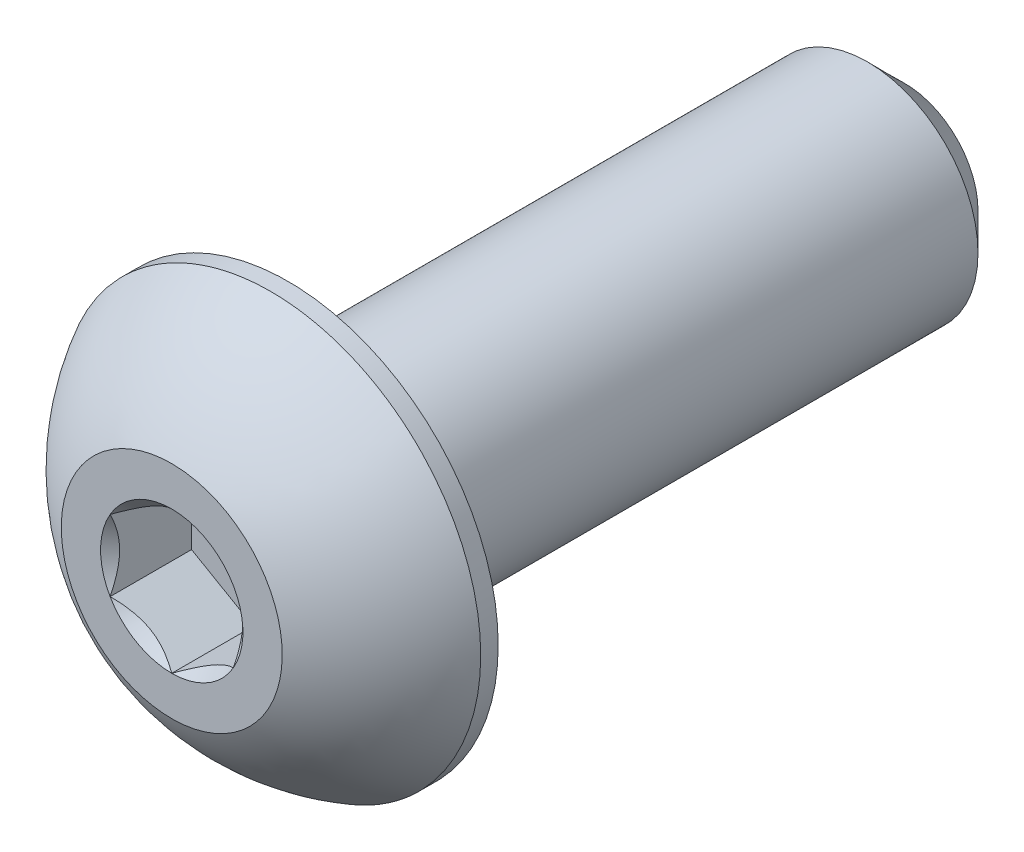
ISO-10303-21;
HEADER;
FILE_DESCRIPTION(('STEP AP214'),'2;1');
FILE_NAME('part.step','',(''),(''),'','','');
FILE_SCHEMA(('AUTOMOTIVE_DESIGN { 1 0 10303 214 1 1 1 1 }'));
ENDSEC;
DATA;
#1=APPLICATION_CONTEXT('core data for automotive mechanical design processes');
#2=APPLICATION_PROTOCOL_DEFINITION('international standard','automotive_design',2000,#1);
#3=PRODUCT_CONTEXT('',#1,'mechanical');
#4=PRODUCT('Part','Part','',(#3));
#5=PRODUCT_RELATED_PRODUCT_CATEGORY('part','',(#4));
#6=PRODUCT_DEFINITION_FORMATION('','',#4);
#7=PRODUCT_DEFINITION_CONTEXT('part definition',#1,'design');
#8=PRODUCT_DEFINITION('design','',#6,#7);
#9=PRODUCT_DEFINITION_SHAPE('','',#8);
#10=(LENGTH_UNIT() NAMED_UNIT(*) SI_UNIT(.MILLI.,.METRE.));
#11=(NAMED_UNIT(*) PLANE_ANGLE_UNIT() SI_UNIT($,.RADIAN.));
#12=(NAMED_UNIT(*) SI_UNIT($,.STERADIAN.) SOLID_ANGLE_UNIT());
#13=UNCERTAINTY_MEASURE_WITH_UNIT(LENGTH_MEASURE(1.E-05),#10,'distance_accuracy_value','');
#14=(GEOMETRIC_REPRESENTATION_CONTEXT(3) GLOBAL_UNCERTAINTY_ASSIGNED_CONTEXT((#13)) GLOBAL_UNIT_ASSIGNED_CONTEXT((#10,
#11,#12)) REPRESENTATION_CONTEXT('',''));
#15=CARTESIAN_POINT('',(0.,0.,0.));
#16=DIRECTION('',(0.,0.,1.));
#17=DIRECTION('',(1.,0.,0.));
#18=AXIS2_PLACEMENT_3D('',#15,#16,#17);
#19=CARTESIAN_POINT('',(0.79375,-0.458271776169265,-1.04902));
#20=DIRECTION('',(0.,0.,1.));
#21=DIRECTION('',(1.,0.,0.));
#22=AXIS2_PLACEMENT_3D('',#19,#20,#21);
#23=PLANE('',#22);
#24=DIRECTION('',(0.,-1.,0.));
#25=VECTOR('',#24,1.);
#26=CARTESIAN_POINT('',(-0.79375,0.458271776169265,-1.04902));
#27=LINE('',#26,#25);
#28=CARTESIAN_POINT('',(-0.79375,0.458271776169265,-1.04902));
#29=VERTEX_POINT('',#28);
#30=CARTESIAN_POINT('',(-0.79375,-0.458271776169265,-1.04902));
#31=VERTEX_POINT('',#30);
#32=EDGE_CURVE('E66',#29,#31,#27,.T.);
#33=ORIENTED_EDGE('',*,*,#32,.T.);
#34=DIRECTION('',(0.866025403784439,-0.5,0.));
#35=VECTOR('',#34,1.);
#36=CARTESIAN_POINT('',(-0.79375,-0.458271776169265,-1.04902));
#37=LINE('',#36,#35);
#38=CARTESIAN_POINT('',(0.,-0.916543552338531,-1.04902));
#39=VERTEX_POINT('',#38);
#40=EDGE_CURVE('E80',#31,#39,#37,.T.);
#41=ORIENTED_EDGE('',*,*,#40,.T.);
#42=DIRECTION('',(0.866025403784438,0.5,0.));
#43=VECTOR('',#42,1.);
#44=CARTESIAN_POINT('',(0.,-0.916543552338531,-1.04902));
#45=LINE('',#44,#43);
#46=CARTESIAN_POINT('',(0.79375,-0.458271776169266,-1.04902));
#47=VERTEX_POINT('',#46);
#48=EDGE_CURVE('E83',#39,#47,#45,.T.);
#49=ORIENTED_EDGE('',*,*,#48,.T.);
#50=DIRECTION('',(0.,1.,0.));
#51=VECTOR('',#50,1.);
#52=CARTESIAN_POINT('',(0.79375,-0.458271776169265,-1.04902));
#53=LINE('',#52,#51);
#54=CARTESIAN_POINT('',(0.79375,0.458271776169266,-1.04902));
#55=VERTEX_POINT('',#54);
#56=EDGE_CURVE('E93',#47,#55,#53,.T.);
#57=ORIENTED_EDGE('',*,*,#56,.T.);
#58=DIRECTION('',(-0.866025403784439,0.5,0.));
#59=VECTOR('',#58,1.);
#60=CARTESIAN_POINT('',(0.79375,0.458271776169265,-1.04902));
#61=LINE('',#60,#59);
#62=CARTESIAN_POINT('',(0.,0.916543552338531,-1.04902));
#63=VERTEX_POINT('',#62);
#64=EDGE_CURVE('E154',#55,#63,#61,.T.);
#65=ORIENTED_EDGE('',*,*,#64,.T.);
#66=DIRECTION('',(-0.866025403784439,-0.5,0.));
#67=VECTOR('',#66,1.);
#68=CARTESIAN_POINT('',(0.,0.916543552338531,-1.04902));
#69=LINE('',#68,#67);
#70=EDGE_CURVE('E71',#63,#29,#69,.T.);
#71=ORIENTED_EDGE('',*,*,#70,.T.);
#72=EDGE_LOOP('',(#33,#41,#49,#57,#65,#71));
#73=FACE_BOUND('',#72,.T.);
#74=ADVANCED_FACE('F17',(#73),#23,.T.);
#75=CARTESIAN_POINT('',(-0.79375,-0.458271776169265,-1.04902));
#76=DIRECTION('',(-0.5,-0.866025403784439,0.));
#77=DIRECTION('',(0.866025403784439,-0.5,0.));
#78=AXIS2_PLACEMENT_3D('',#75,#76,#77);
#79=PLANE('',#78);
#80=CARTESIAN_POINT('',(-0.793750000044271,-0.458271776130436,-1.04125312176689E-10));
#81=CARTESIAN_POINT('',(-0.766468387450507,-0.474022822513867,-0.0157358559855346));
#82=CARTESIAN_POINT('',(-0.738730682472508,-0.490037193953111,-0.0305474421759015));
#83=CARTESIAN_POINT('',(-0.682170655110562,-0.522692140978474,-0.0576668291019256));
#84=CARTESIAN_POINT('',(-0.653342956801861,-0.539335820356173,-0.0699595455816493));
#85=CARTESIAN_POINT('',(-0.595213203716242,-0.572897048947402,-0.0910168993629999));
#86=CARTESIAN_POINT('',(-0.5659259466282,-0.589806054711257,-0.0998344520441804));
#87=CARTESIAN_POINT('',(-0.506707298360598,-0.62399595722978,-0.113420138665816));
#88=CARTESIAN_POINT('',(-0.476777713816787,-0.641275810922814,-0.118198408154988));
#89=CARTESIAN_POINT('',(-0.425189875392761,-0.671060063323802,-0.122508260378903));
#90=CARTESIAN_POINT('',(-0.403598614309553,-0.683525783722347,-0.123145100154246));
#91=CARTESIAN_POINT('',(-0.360457981213041,-0.708433039853636,-0.122071781230141));
#92=CARTESIAN_POINT('',(-0.338908619505792,-0.720874569636178,-0.120361104085362));
#93=CARTESIAN_POINT('',(-0.274568421610871,-0.758021400210521,-0.111820865145472));
#94=CARTESIAN_POINT('',(-0.232097867856869,-0.782541785853028,-0.101582134265545));
#95=CARTESIAN_POINT('',(-0.157588950632502,-0.825559529269546,-0.0768844661670983));
#96=CARTESIAN_POINT('',(-0.125199877328505,-0.84425936946041,-0.0637246411289968));
#97=CARTESIAN_POINT('',(-0.0616892984270224,-0.88092721928557,-0.034082605181529));
#98=CARTESIAN_POINT('',(-0.0305640530961798,-0.898897388055925,-0.0176112094626359));
#99=CARTESIAN_POINT('',(5.13890344620887E-11,-0.9165435523682,-1.09633071497901E-10));
#100=B_SPLINE_CURVE_WITH_KNOTS('',3,(#80,#81,#82,#83,#84,#85,#86,#87,#88,#89,#90,#91,#92,#93,
#94,#95,#96,#97,#98,#99),.UNSPECIFIED.,.F.,.F.,(4,2,2,2,2,2,2,2,2,4),(0.,0.105713963861361,
0.212043598564815,0.316685078197273,0.421063200739261,0.495773440531131,0.570500182614758,
0.719996020516862,0.838779765648098,0.957181701332613),.UNSPECIFIED.);
#101=CARTESIAN_POINT('',(-0.793750000035706,-0.45827177618988,-9.80729717584741E-11));
#102=VERTEX_POINT('',#101);
#103=CARTESIAN_POINT('',(-4.53114056498212E-11,-0.916543552394829,-8.30040836589947E-11));
#104=VERTEX_POINT('',#103);
#105=EDGE_CURVE('E20',#102,#104,#100,.T.);
#106=ORIENTED_EDGE('',*,*,#105,.T.);
#107=DIRECTION('',(0.,0.,1.));
#108=VECTOR('',#107,1.);
#109=CARTESIAN_POINT('',(0.,-0.916543552338531,-1.04902));
#110=LINE('',#109,#108);
#111=EDGE_CURVE('E87',#104,#39,#110,.F.);
#112=ORIENTED_EDGE('',*,*,#111,.T.);
#113=ORIENTED_EDGE('',*,*,#40,.F.);
#114=DIRECTION('',(0.,0.,1.));
#115=VECTOR('',#114,1.);
#116=CARTESIAN_POINT('',(-0.79375,-0.458271776169265,-1.04902));
#117=LINE('',#116,#115);
#118=EDGE_CURVE('E58',#31,#102,#117,.T.);
#119=ORIENTED_EDGE('',*,*,#118,.T.);
#120=EDGE_LOOP('',(#106,#112,#113,#119));
#121=FACE_BOUND('',#120,.T.);
#122=ADVANCED_FACE('F88',(#121),#79,.F.);
#123=CARTESIAN_POINT('',(0.,-0.916543552338531,-1.04902));
#124=DIRECTION('',(0.5,-0.866025403784438,0.));
#125=DIRECTION('',(0.866025403784438,0.5,0.));
#126=AXIS2_PLACEMENT_3D('',#123,#124,#125);
#127=PLANE('',#126);
#128=CARTESIAN_POINT('',(-5.57626616020397E-11,-0.916543552357456,-1.04125185523009E-10));
#129=CARTESIAN_POINT('',(0.0272816125453579,-0.900792505986767,-0.0157358559855344));
#130=CARTESIAN_POINT('',(0.0550193175263822,-0.884778134552763,-0.0305474421759013));
#131=CARTESIAN_POINT('',(0.111579344890555,-0.852123187531257,-0.0576668291019255));
#132=CARTESIAN_POINT('',(0.140407043198436,-0.835479508152137,-0.0699595455816492));
#133=CARTESIAN_POINT('',(0.198536796283466,-0.801918279559889,-0.0910168993629998));
#134=CARTESIAN_POINT('',(0.227824053371723,-0.785009273796406,-0.0998344520441803));
#135=CARTESIAN_POINT('',(0.287042701639479,-0.750819371278149,-0.113420138665816));
#136=CARTESIAN_POINT('',(0.31697228618323,-0.733539517585012,-0.118198408154988));
#137=CARTESIAN_POINT('',(0.368560124607226,-0.703755265183972,-0.122508260378903));
#138=CARTESIAN_POINT('',(0.390151385690444,-0.691289544785444,-0.123145100154246));
#139=CARTESIAN_POINT('',(0.433292018786962,-0.666382288654166,-0.122071781230141));
#140=CARTESIAN_POINT('',(0.454841380494209,-0.65394075887162,-0.120361104085362));
#141=CARTESIAN_POINT('',(0.519181578389127,-0.616793928297271,-0.111820865145472));
#142=CARTESIAN_POINT('',(0.56165213214313,-0.592273542654767,-0.101582134265545));
#143=CARTESIAN_POINT('',(0.636161049367499,-0.549255799238251,-0.0768844661670984));
#144=CARTESIAN_POINT('',(0.668550122671495,-0.530555959047386,-0.0637246411289968));
#145=CARTESIAN_POINT('',(0.732060701572977,-0.493888109222226,-0.0340826051815291));
#146=CARTESIAN_POINT('',(0.763185946903819,-0.475917940451871,-0.0176112094626361));
#147=CARTESIAN_POINT('',(0.793750000051388,-0.458271776139596,-1.09633618367451E-10));
#148=B_SPLINE_CURVE_WITH_KNOTS('',3,(#128,#129,#130,#131,#132,#133,#134,#135,#136,#137,#138,
#139,#140,#141,#142,#143,#144,#145,#146,#147),.UNSPECIFIED.,.F.,.F.,(4,2,2,2,2,2,2,2,2,4),(0.,
0.105713963861361,0.212043598564815,0.316685078197273,0.421063200739261,0.495773440531131,
0.570500182614758,0.719996020516862,0.838779765648097,0.957181701332612),.UNSPECIFIED.);
#149=CARTESIAN_POINT('',(0.7937500000261,-0.458271776236655,-8.30043156681813E-11));
#150=VERTEX_POINT('',#149);
#151=EDGE_CURVE('E198',#104,#150,#148,.T.);
#152=ORIENTED_EDGE('',*,*,#151,.T.);
#153=DIRECTION('',(0.,0.,-1.));
#154=VECTOR('',#153,1.);
#155=CARTESIAN_POINT('',(0.79375,-0.458271776169266,-1.04902));
#156=LINE('',#155,#154);
#157=EDGE_CURVE('E97',#150,#47,#156,.T.);
#158=ORIENTED_EDGE('',*,*,#157,.T.);
#159=ORIENTED_EDGE('',*,*,#48,.F.);
#160=ORIENTED_EDGE('',*,*,#111,.F.);
#161=EDGE_LOOP('',(#152,#158,#159,#160));
#162=FACE_BOUND('',#161,.T.);
#163=ADVANCED_FACE('F95',(#162),#127,.F.);
#164=CARTESIAN_POINT('',(0.79375,-0.458271776169265,-1.04902));
#165=DIRECTION('',(1.,0.,0.));
#166=DIRECTION('',(0.,0.,-1.));
#167=AXIS2_PLACEMENT_3D('',#164,#165,#166);
#168=PLANE('',#167);
#169=ORIENTED_EDGE('',*,*,#157,.F.);
#170=CARTESIAN_POINT('',(0.793749999988507,-0.45827177622702,-1.04124807207434E-10));
#171=CARTESIAN_POINT('',(0.793749999995949,-0.426975491120204,-0.0156334823290867));
#172=CARTESIAN_POINT('',(0.793749999998932,-0.395159312437869,-0.0303541871307825));
#173=CARTESIAN_POINT('',(0.793750000001075,-0.330270832168188,-0.0573375404735409));
#174=CARTESIAN_POINT('',(0.79375000000021,-0.297191783766413,-0.0695838207478088));
#175=CARTESIAN_POINT('',(0.79374999999979,-0.230077553297126,-0.0907303862536866));
#176=CARTESIAN_POINT('',(0.79375000000023,-0.196046036759007,-0.0996419954010723));
#177=CARTESIAN_POINT('',(0.793749999999771,-0.12723734314259,-0.113362287148023));
#178=CARTESIAN_POINT('',(0.793749999998876,-0.0924628174825495,-0.11818365742675));
#179=CARTESIAN_POINT('',(0.793750000000308,-0.0479673001981395,-0.121403400473781));
#180=CARTESIAN_POINT('',(0.793750000000769,-0.0383784693535908,-0.121923817410378));
#181=CARTESIAN_POINT('',(0.793749999999232,-0.0191940940711562,-0.122619661903583));
#182=CARTESIAN_POINT('',(0.793749999997236,-0.00959855611755325,-0.122795276868053));
#183=CARTESIAN_POINT('',(0.793749999988855,0.048150555244362,-0.122784902171998));
#184=CARTESIAN_POINT('',(0.793749999997034,0.0963770615085844,-0.118313570183656));
#185=CARTESIAN_POINT('',(0.793750000002982,0.19155332040365,-0.101373453476739));
#186=CARTESIAN_POINT('',(0.793750000000694,0.23849465334187,-0.0888610878914763));
#187=CARTESIAN_POINT('',(0.793749999999547,0.314361329222952,-0.0632781708149289));
#188=CARTESIAN_POINT('',(0.793749999999774,0.343890227762418,-0.0519052657489363));
#189=CARTESIAN_POINT('',(0.793750000000223,0.401829965193103,-0.0272563335571695));
#190=CARTESIAN_POINT('',(0.793750000000445,0.43024856008334,-0.013998664808802));
#191=CARTESIAN_POINT('',(0.79375,0.458271776228839,-1.09515576499543E-10));
#192=B_SPLINE_CURVE_WITH_KNOTS('',3,(#170,#171,#172,#173,#174,#175,#176,#177,#178,#179,#180,
#181,#182,#183,#184,#185,#186,#187,#188,#189,#190,#191),.UNSPECIFIED.,.F.,.F.,(4,2,2,2,2,2,2,2,
2,2,4),(0.,0.105023602081725,0.210720694332322,0.316055529756216,0.421062415438341,
0.449866476755791,0.478654878059728,0.623070089098305,0.768274680598115,0.863134860661354,
0.957127400661586),.UNSPECIFIED.);
#193=CARTESIAN_POINT('',(0.793750000071411,0.458271776158173,-8.30040728464291E-11));
#194=VERTEX_POINT('',#193);
#195=EDGE_CURVE('E176',#150,#194,#192,.T.);
#196=ORIENTED_EDGE('',*,*,#195,.T.);
#197=DIRECTION('',(0.,0.,1.));
#198=VECTOR('',#197,1.);
#199=CARTESIAN_POINT('',(0.79375,0.458271776169266,-1.04902));
#200=LINE('',#199,#198);
#201=EDGE_CURVE('E151',#194,#55,#200,.F.);
#202=ORIENTED_EDGE('',*,*,#201,.T.);
#203=ORIENTED_EDGE('',*,*,#56,.F.);
#204=EDGE_LOOP('',(#169,#196,#202,#203));
#205=FACE_BOUND('',#204,.T.);
#206=ADVANCED_FACE('F175',(#205),#168,.F.);
#207=CARTESIAN_POINT('',(0.79375,0.458271776169265,-1.04902));
#208=DIRECTION('',(0.5,0.866025403784439,0.));
#209=DIRECTION('',(-0.866025403784439,0.5,0.));
#210=AXIS2_PLACEMENT_3D('',#207,#208,#209);
#211=PLANE('',#210);
#212=CARTESIAN_POINT('',(0.793750000044271,0.458271776130436,-1.04125160887464E-10));
#213=CARTESIAN_POINT('',(0.766468387450507,0.474022822513867,-0.0157358559855344));
#214=CARTESIAN_POINT('',(0.738730682472508,0.490037193953111,-0.0305474421759014));
#215=CARTESIAN_POINT('',(0.682170655110562,0.522692140978474,-0.0576668291019255));
#216=CARTESIAN_POINT('',(0.653342956801861,0.539335820356173,-0.0699595455816493));
#217=CARTESIAN_POINT('',(0.595213203716242,0.572897048947402,-0.0910168993629999));
#218=CARTESIAN_POINT('',(0.5659259466282,0.589806054711257,-0.0998344520441804));
#219=CARTESIAN_POINT('',(0.506707298360598,0.62399595722978,-0.113420138665816));
#220=CARTESIAN_POINT('',(0.476777713816787,0.641275810922814,-0.118198408154987));
#221=CARTESIAN_POINT('',(0.425189875392761,0.671060063323802,-0.122508260378903));
#222=CARTESIAN_POINT('',(0.403598614309553,0.683525783722347,-0.123145100154246));
#223=CARTESIAN_POINT('',(0.360457981213041,0.708433039853636,-0.122071781230141));
#224=CARTESIAN_POINT('',(0.338908619505792,0.720874569636178,-0.120361104085362));
#225=CARTESIAN_POINT('',(0.274568421610871,0.758021400210521,-0.111820865145471));
#226=CARTESIAN_POINT('',(0.232097867856869,0.782541785853028,-0.101582134265545));
#227=CARTESIAN_POINT('',(0.157588950632502,0.825559529269546,-0.0768844661670982));
#228=CARTESIAN_POINT('',(0.125199877328505,0.84425936946041,-0.0637246411289966));
#229=CARTESIAN_POINT('',(0.0616892984270225,0.88092721928557,-0.0340826051815287));
#230=CARTESIAN_POINT('',(0.0305640530961799,0.898897388055925,-0.0176112094626356));
#231=CARTESIAN_POINT('',(-5.13889953211007E-11,0.9165435523682,-1.09633010018288E-10));
#232=B_SPLINE_CURVE_WITH_KNOTS('',3,(#212,#213,#214,#215,#216,#217,#218,#219,#220,#221,#222,
#223,#224,#225,#226,#227,#228,#229,#230,#231),.UNSPECIFIED.,.F.,.F.,(4,2,2,2,2,2,2,2,2,4),(0.,
0.105713963861361,0.212043598564815,0.316685078197273,0.421063200739261,0.495773440531131,
0.570500182614758,0.719996020516862,0.838779765648098,0.957181701332613),.UNSPECIFIED.);
#233=CARTESIAN_POINT('',(4.53111479032544E-11,0.916543552394829,-8.30040559086843E-11));
#234=VERTEX_POINT('',#233);
#235=EDGE_CURVE('E181',#194,#234,#232,.T.);
#236=ORIENTED_EDGE('',*,*,#235,.T.);
#237=DIRECTION('',(0.,0.,1.));
#238=VECTOR('',#237,1.);
#239=CARTESIAN_POINT('',(0.,0.916543552338531,-1.04902));
#240=LINE('',#239,#238);
#241=EDGE_CURVE('E146',#234,#63,#240,.F.);
#242=ORIENTED_EDGE('',*,*,#241,.T.);
#243=ORIENTED_EDGE('',*,*,#64,.F.);
#244=ORIENTED_EDGE('',*,*,#201,.F.);
#245=EDGE_LOOP('',(#236,#242,#243,#244));
#246=FACE_BOUND('',#245,.T.);
#247=ADVANCED_FACE('F179',(#246),#211,.F.);
#248=CARTESIAN_POINT('',(0.,0.916543552338531,-1.04902));
#249=DIRECTION('',(-0.5,0.866025403784439,0.));
#250=DIRECTION('',(-0.866025403784439,-0.5,0.));
#251=AXIS2_PLACEMENT_3D('',#248,#249,#250);
#252=PLANE('',#251);
#253=CARTESIAN_POINT('',(5.57626530607984E-11,0.916543552357456,-1.04125131494519E-10));
#254=CARTESIAN_POINT('',(-0.027281612545358,0.900792505986767,-0.0157358559855344));
#255=CARTESIAN_POINT('',(-0.0550193175263823,0.884778134552763,-0.0305474421759013));
#256=CARTESIAN_POINT('',(-0.111579344890555,0.852123187531257,-0.0576668291019255));
#257=CARTESIAN_POINT('',(-0.140407043198436,0.835479508152137,-0.0699595455816492));
#258=CARTESIAN_POINT('',(-0.198536796283466,0.801918279559889,-0.0910168993629998));
#259=CARTESIAN_POINT('',(-0.227824053371723,0.785009273796406,-0.0998344520441803));
#260=CARTESIAN_POINT('',(-0.287042701639479,0.750819371278149,-0.113420138665816));
#261=CARTESIAN_POINT('',(-0.316972286183231,0.733539517585012,-0.118198408154987));
#262=CARTESIAN_POINT('',(-0.368560124607226,0.703755265183972,-0.122508260378902));
#263=CARTESIAN_POINT('',(-0.390151385690444,0.691289544785444,-0.123145100154246));
#264=CARTESIAN_POINT('',(-0.433292018786962,0.666382288654166,-0.122071781230141));
#265=CARTESIAN_POINT('',(-0.454841380494209,0.65394075887162,-0.120361104085362));
#266=CARTESIAN_POINT('',(-0.519181578389127,0.616793928297271,-0.111820865145471));
#267=CARTESIAN_POINT('',(-0.56165213214313,0.592273542654767,-0.101582134265545));
#268=CARTESIAN_POINT('',(-0.636161049367499,0.549255799238251,-0.0768844661670981));
#269=CARTESIAN_POINT('',(-0.668550122671495,0.530555959047386,-0.0637246411289966));
#270=CARTESIAN_POINT('',(-0.732060701572977,0.493888109222226,-0.034082605181529));
#271=CARTESIAN_POINT('',(-0.763185946903819,0.475917940451871,-0.017611209462636));
#272=CARTESIAN_POINT('',(-0.793750000051388,0.458271776139596,-1.09633305019665E-10));
#273=B_SPLINE_CURVE_WITH_KNOTS('',3,(#253,#254,#255,#256,#257,#258,#259,#260,#261,#262,#263,
#264,#265,#266,#267,#268,#269,#270,#271,#272),.UNSPECIFIED.,.F.,.F.,(4,2,2,2,2,2,2,2,2,4),(0.,
0.105713963861361,0.212043598564815,0.316685078197273,0.421063200739261,0.495773440531131,
0.570500182614758,0.719996020516862,0.838779765648098,0.957181701332612),.UNSPECIFIED.);
#274=CARTESIAN_POINT('',(-0.7937500000261,0.458271776236656,-8.30041665023388E-11));
#275=VERTEX_POINT('',#274);
#276=EDGE_CURVE('E39',#234,#275,#273,.T.);
#277=ORIENTED_EDGE('',*,*,#276,.T.);
#278=DIRECTION('',(0.,0.,1.));
#279=VECTOR('',#278,1.);
#280=CARTESIAN_POINT('',(-0.79375,0.458271776169265,-1.04902));
#281=LINE('',#280,#279);
#282=EDGE_CURVE('E139',#275,#29,#281,.F.);
#283=ORIENTED_EDGE('',*,*,#282,.T.);
#284=ORIENTED_EDGE('',*,*,#70,.F.);
#285=ORIENTED_EDGE('',*,*,#241,.F.);
#286=EDGE_LOOP('',(#277,#283,#284,#285));
#287=FACE_BOUND('',#286,.T.);
#288=ADVANCED_FACE('F183',(#287),#252,.F.);
#289=CARTESIAN_POINT('',(-0.79375,0.458271776169265,-1.04902));
#290=DIRECTION('',(-1.,0.,0.));
#291=DIRECTION('',(0.,-1.,0.));
#292=AXIS2_PLACEMENT_3D('',#289,#290,#291);
#293=PLANE('',#292);
#294=CARTESIAN_POINT('',(-0.793749999988508,0.45827177622702,-1.04125076061874E-10));
#295=CARTESIAN_POINT('',(-0.793749999995865,0.426769683460379,-0.0157358559845614));
#296=CARTESIAN_POINT('',(-0.79374999999889,0.394740940574534,-0.0305474421734395));
#297=CARTESIAN_POINT('',(-0.793750000001117,0.329431046502482,-0.0576668290950985));
#298=CARTESIAN_POINT('',(-0.793750000000297,0.29614368773308,-0.0699595455719423));
#299=CARTESIAN_POINT('',(-0.793749999999708,0.229021230525101,-0.091016899345833));
#300=CARTESIAN_POINT('',(-0.793749999999923,0.195203218985849,-0.0998344520224844));
#301=CARTESIAN_POINT('',(-0.793750000000077,0.126823413925851,-0.113420138633486));
#302=CARTESIAN_POINT('',(-0.793750000000017,0.0922637065283722,-0.118198408116553));
#303=CARTESIAN_POINT('',(-0.793749999999987,0.0326952017001382,-0.122508260329613));
#304=CARTESIAN_POINT('',(-0.793749999999996,0.00776376088789638,-0.123145100099761));
#305=CARTESIAN_POINT('',(-0.793750000000003,-0.0420507514044413,-0.122071781163585));
#306=CARTESIAN_POINT('',(-0.793750000000001,-0.0669338109841309,-0.12036110401193));
#307=CARTESIAN_POINT('',(-0.793749999999997,-0.14122747217563,-0.111820865049612));
#308=CARTESIAN_POINT('',(-0.793749999999999,-0.190268243487815,-0.101582134152341));
#309=CARTESIAN_POINT('',(-0.79375,-0.276303730289792,-0.0768844660440666));
#310=CARTESIAN_POINT('',(-0.79375,-0.31370341061652,-0.0637246410228027));
#311=CARTESIAN_POINT('',(-0.79375,-0.387039110161463,-0.034082605120921));
#312=CARTESIAN_POINT('',(-0.793749999999999,-0.422979447651795,-0.0176112094307704));
#313=CARTESIAN_POINT('',(-0.79375,-0.458271776228604,-1.09633234653498E-10));
#314=B_SPLINE_CURVE_WITH_KNOTS('',3,(#294,#295,#296,#297,#298,#299,#300,#301,#302,#303,#304,
#305,#306,#307,#308,#309,#310,#311,#312,#313),.UNSPECIFIED.,.F.,.F.,(4,2,2,2,2,2,2,2,2,4),(0.,
0.105713963893701,0.212043598629504,0.316685078293012,0.421063200866023,0.495773440702881,
0.570500182831549,0.719996020823837,0.838779765783769,0.957181701296401),.UNSPECIFIED.);
#315=EDGE_CURVE('E188',#275,#102,#314,.T.);
#316=ORIENTED_EDGE('',*,*,#315,.T.);
#317=ORIENTED_EDGE('',*,*,#118,.F.);
#318=ORIENTED_EDGE('',*,*,#32,.F.);
#319=ORIENTED_EDGE('',*,*,#282,.F.);
#320=EDGE_LOOP('',(#316,#317,#318,#319));
#321=FACE_BOUND('',#320,.T.);
#322=ADVANCED_FACE('F186',(#321),#293,.F.);
#323=CARTESIAN_POINT('',(0.,0.,-5.6843418860808E-11));
#324=DIRECTION('',(0.,0.,1.));
#325=DIRECTION('',(1.,0.,0.));
#326=AXIS2_PLACEMENT_3D('',#323,#324,#325);
#327=CONICAL_SURFACE('',#326,0.91654355242099,0.785398163397448);
#328=ORIENTED_EDGE('',*,*,#105,.F.);
#329=CARTESIAN_POINT('',(0.,0.,-5.6843418860808E-11));
#330=DIRECTION('',(0.,0.,1.));
#331=DIRECTION('',(1.,0.,0.));
#332=AXIS2_PLACEMENT_3D('',#329,#330,#331);
#333=CIRCLE('',#332,0.91654355242099);
#334=EDGE_CURVE('E192',#102,#104,#333,.T.);
#335=ORIENTED_EDGE('',*,*,#334,.T.);
#336=EDGE_LOOP('',(#328,#335));
#337=FACE_BOUND('',#336,.T.);
#338=ADVANCED_FACE('F195',(#337),#327,.F.);
#339=CARTESIAN_POINT('',(0.,0.,-5.6843418860808E-11));
#340=DIRECTION('',(0.,0.,1.));
#341=DIRECTION('',(1.,0.,0.));
#342=AXIS2_PLACEMENT_3D('',#339,#340,#341);
#343=CONICAL_SURFACE('',#342,0.91654355242099,0.785398163397448);
#344=ORIENTED_EDGE('',*,*,#151,.F.);
#345=CARTESIAN_POINT('',(0.,0.,-5.6843418860808E-11));
#346=DIRECTION('',(0.,0.,1.));
#347=DIRECTION('',(1.,0.,0.));
#348=AXIS2_PLACEMENT_3D('',#345,#346,#347);
#349=CIRCLE('',#348,0.91654355242099);
#350=EDGE_CURVE('E206',#104,#150,#349,.T.);
#351=ORIENTED_EDGE('',*,*,#350,.T.);
#352=EDGE_LOOP('',(#344,#351));
#353=FACE_BOUND('',#352,.T.);
#354=ADVANCED_FACE('F259',(#353),#343,.F.);
#355=CARTESIAN_POINT('',(0.,0.,-5.6843418860808E-11));
#356=DIRECTION('',(0.,0.,1.));
#357=DIRECTION('',(1.,0.,0.));
#358=AXIS2_PLACEMENT_3D('',#355,#356,#357);
#359=CONICAL_SURFACE('',#358,0.91654355242099,0.785398163397448);
#360=ORIENTED_EDGE('',*,*,#195,.F.);
#361=CARTESIAN_POINT('',(0.,0.,-5.6843418860808E-11));
#362=DIRECTION('',(0.,0.,1.));
#363=DIRECTION('',(1.,0.,0.));
#364=AXIS2_PLACEMENT_3D('',#361,#362,#363);
#365=CIRCLE('',#364,0.91654355242099);
#366=EDGE_CURVE('E208',#150,#194,#365,.T.);
#367=ORIENTED_EDGE('',*,*,#366,.T.);
#368=EDGE_LOOP('',(#360,#367));
#369=FACE_BOUND('',#368,.T.);
#370=ADVANCED_FACE('F234',(#369),#359,.F.);
#371=CARTESIAN_POINT('',(0.,0.,-5.6843418860808E-11));
#372=DIRECTION('',(0.,0.,1.));
#373=DIRECTION('',(1.,0.,0.));
#374=AXIS2_PLACEMENT_3D('',#371,#372,#373);
#375=CONICAL_SURFACE('',#374,0.91654355242099,0.785398163397448);
#376=ORIENTED_EDGE('',*,*,#235,.F.);
#377=CARTESIAN_POINT('',(0.,0.,-5.6843418860808E-11));
#378=DIRECTION('',(0.,0.,1.));
#379=DIRECTION('',(1.,0.,0.));
#380=AXIS2_PLACEMENT_3D('',#377,#378,#379);
#381=CIRCLE('',#380,0.91654355242099);
#382=EDGE_CURVE('E428',#194,#234,#381,.T.);
#383=ORIENTED_EDGE('',*,*,#382,.T.);
#384=EDGE_LOOP('',(#376,#383));
#385=FACE_BOUND('',#384,.T.);
#386=ADVANCED_FACE('F229',(#385),#375,.F.);
#387=CARTESIAN_POINT('',(0.,0.,-5.6843418860808E-11));
#388=DIRECTION('',(0.,0.,1.));
#389=DIRECTION('',(1.,0.,0.));
#390=AXIS2_PLACEMENT_3D('',#387,#388,#389);
#391=CONICAL_SURFACE('',#390,0.91654355242099,0.785398163397448);
#392=ORIENTED_EDGE('',*,*,#276,.F.);
#393=CARTESIAN_POINT('',(0.,0.,-5.6843418860808E-11));
#394=DIRECTION('',(0.,0.,1.));
#395=DIRECTION('',(1.,0.,0.));
#396=AXIS2_PLACEMENT_3D('',#393,#394,#395);
#397=CIRCLE('',#396,0.91654355242099);
#398=EDGE_CURVE('E202',#234,#275,#397,.T.);
#399=ORIENTED_EDGE('',*,*,#398,.T.);
#400=EDGE_LOOP('',(#392,#399));
#401=FACE_BOUND('',#400,.T.);
#402=ADVANCED_FACE('F225',(#401),#391,.F.);
#403=CARTESIAN_POINT('',(0.,0.,-5.6843418860808E-11));
#404=DIRECTION('',(0.,0.,1.));
#405=DIRECTION('',(1.,0.,0.));
#406=AXIS2_PLACEMENT_3D('',#403,#404,#405);
#407=CONICAL_SURFACE('',#406,0.91654355242099,0.785398163627513);
#408=ORIENTED_EDGE('',*,*,#315,.F.);
#409=CARTESIAN_POINT('',(0.,0.,-5.6843418860808E-11));
#410=DIRECTION('',(0.,0.,1.));
#411=DIRECTION('',(1.,0.,0.));
#412=AXIS2_PLACEMENT_3D('',#409,#410,#411);
#413=CIRCLE('',#412,0.91654355242099);
#414=EDGE_CURVE('E124',#275,#102,#413,.T.);
#415=ORIENTED_EDGE('',*,*,#414,.T.);
#416=EDGE_LOOP('',(#408,#415));
#417=FACE_BOUND('',#416,.T.);
#418=ADVANCED_FACE('F199',(#417),#407,.F.);
#419=CARTESIAN_POINT('',(0.,-1.4224,0.));
#420=DIRECTION('',(0.,0.,-1.));
#421=DIRECTION('',(-1.,0.,0.));
#422=AXIS2_PLACEMENT_3D('',#419,#420,#421);
#423=PLANE('',#422);
#424=CARTESIAN_POINT('',(0.,1.4224,0.));
#425=CARTESIAN_POINT('',(0.079837401506792,1.42239547960122,-3.10512084195004E-13));
#426=CARTESIAN_POINT('',(0.159816890979197,1.41564125649137,-2.54771425349114E-13));
#427=CARTESIAN_POINT('',(0.278015341078673,1.39554324162256,1.27395008212406E-13));
#428=CARTESIAN_POINT('',(0.317169786053088,1.38716526414384,3.04971979109462E-13));
#429=CARTESIAN_POINT('',(0.394672406919851,1.36713459799427,-3.05653838944721E-13));
#430=CARTESIAN_POINT('',(0.433019901263231,1.35547925187481,-1.09464211558566E-12));
#431=CARTESIAN_POINT('',(0.546247055408394,1.31575749798253,-1.80573643707766E-12));
#432=CARTESIAN_POINT('',(0.619501966382146,1.28290274979833,0.));
#433=CARTESIAN_POINT('',(0.759450382596395,1.20534511953095,0.));
#434=CARTESIAN_POINT('',(0.82614363827783,1.16064178704991,-1.47228847149697E-12));
#435=CARTESIAN_POINT('',(0.919813661930283,1.08571189888457,-9.31230899750024E-13));
#436=CARTESIAN_POINT('',(0.9499930060288,1.05940300307192,-2.70461241575003E-13));
#437=CARTESIAN_POINT('',(1.00800204913133,1.00436597738277,2.69767004400426E-13));
#438=CARTESIAN_POINT('',(1.0358339854928,0.975640204468675,1.49978279507414E-13));
#439=CARTESIAN_POINT('',(1.11556504917461,0.886067212807749,-3.00510714195094E-13));
#440=CARTESIAN_POINT('',(1.16371969226268,0.82180808101778,-7.22352144939527E-13));
#441=CARTESIAN_POINT('',(1.24852874079769,0.686152308566838,-6.06014550552047E-13));
#442=CARTESIAN_POINT('',(1.28518357988482,0.614755937174268,0.));
#443=CARTESIAN_POINT('',(1.34599329626744,0.466814812468538,0.));
#444=CARTESIAN_POINT('',(1.37014830706691,0.390270114151778,-3.35386386916116E-13));
#445=CARTESIAN_POINT('',(1.40526284596798,0.234213649950182,-3.89294489118235E-13));
#446=CARTESIAN_POINT('',(1.41622230359971,0.154701868222199,0.));
#447=CARTESIAN_POINT('',(1.42463783082892,-0.00503311191648913,0.));
#448=CARTESIAN_POINT('',(1.4220939004264,-0.0852563103271954,-2.28662398122606E-13));
#449=CARTESIAN_POINT('',(1.40357169195069,-0.244138589560941,-2.56626419612562E-13));
#450=CARTESIAN_POINT('',(1.38759348562201,-0.322797678734662,0.));
#451=CARTESIAN_POINT('',(1.34266561054543,-0.476309515499134,0.));
#452=CARTESIAN_POINT('',(1.31371580325374,-0.551162222426134,-1.93539927079388E-13));
#453=CARTESIAN_POINT('',(1.24363054657929,-0.694978494487184,-2.46647156385589E-13));
#454=CARTESIAN_POINT('',(1.20249463766303,-0.763941837409073,0.));
#455=CARTESIAN_POINT('',(1.13261701585501,-0.861396859451871,0.));
#456=CARTESIAN_POINT('',(1.10795757154424,-0.892888104543527,0.));
#457=CARTESIAN_POINT('',(1.05605278474119,-0.95371586453266,0.));
#458=CARTESIAN_POINT('',(1.02880496961481,-0.983050270610389,-2.51540391233719E-13));
#459=CARTESIAN_POINT('',(0.943526899757114,-1.0674079156279,-3.70465482614977E-13));
#460=CARTESIAN_POINT('',(0.881900142255518,-1.11887169947789,0.));
#461=CARTESIAN_POINT('',(0.750875987896364,-1.21070533268511,0.));
#462=CARTESIAN_POINT('',(0.681478886542779,-1.25107560372394,-7.67040666017821E-13));
#463=CARTESIAN_POINT('',(0.573052388771771,-1.30247502735156,-4.90234771403485E-13));
#464=CARTESIAN_POINT('',(0.536141890999565,-1.31809528886646,-1.83784852842444E-13));
#465=CARTESIAN_POINT('',(0.461173079066027,-1.34615880726507,1.83202016109116E-13));
#466=CARTESIAN_POINT('',(0.423115721917304,-1.3586046352709,2.43938577645002E-13));
#467=CARTESIAN_POINT('',(0.307683445892093,-1.39101132376675,-4.8724748659077E-13));
#468=CARTESIAN_POINT('',(0.228856428731041,-1.40613215812132,-2.18745982357455E-12));
#469=CARTESIAN_POINT('',(0.124634287079559,-1.4171504345333,-8.23179158551496E-13));
#470=CARTESIAN_POINT('',(0.0997515641569435,-1.41911732246,-2.30307852998134E-13));
#471=CARTESIAN_POINT('',(0.0499171921482226,-1.42174281196867,2.29874172129268E-13));
#472=CARTESIAN_POINT('',(0.0249655430621171,-1.42240141355064,0.));
#473=CARTESIAN_POINT('',(-0.0798374015067915,-1.42239547960122,-3.09877645521214E-13));
#474=CARTESIAN_POINT('',(-0.159816890979197,-1.41564125649137,-2.54665844735477E-13));
#475=CARTESIAN_POINT('',(-0.278015341078672,-1.39554324162256,1.27342079143021E-13));
#476=CARTESIAN_POINT('',(-0.317169786053087,-1.38716526414384,3.04972497368859E-13));
#477=CARTESIAN_POINT('',(-0.39467240691985,-1.36713459799427,-3.05654357625565E-13));
#478=CARTESIAN_POINT('',(-0.43301990126323,-1.3554792518748,-1.09469720634064E-12));
#479=CARTESIAN_POINT('',(-0.546247055408393,-1.31575749798253,-1.80562651817882E-12));
#480=CARTESIAN_POINT('',(-0.619501966382145,-1.28290274979833,0.));
#481=CARTESIAN_POINT('',(-0.759450382596394,-1.20534511953095,0.));
#482=CARTESIAN_POINT('',(-0.826143638277829,-1.16064178704991,-1.4748042964015E-12));
#483=CARTESIAN_POINT('',(-0.919813661930282,-1.08571189888457,-9.32574560744384E-13));
#484=CARTESIAN_POINT('',(-0.949993006028799,-1.05940300307192,-2.70751983740324E-13));
#485=CARTESIAN_POINT('',(-1.00800204913133,-1.00436597738277,2.7005746624651E-13));
#486=CARTESIAN_POINT('',(-1.0358339854928,-0.975640204468674,1.49798495533553E-13));
#487=CARTESIAN_POINT('',(-1.11556504917461,-0.886067212807747,-3.00151261597888E-13));
#488=CARTESIAN_POINT('',(-1.16371969226268,-0.821808081017778,-7.19034788554936E-13));
#489=CARTESIAN_POINT('',(-1.24852874079768,-0.686152308566836,-6.02393018768526E-13));
#490=CARTESIAN_POINT('',(-1.28518357988482,-0.614755937174267,0.));
#491=CARTESIAN_POINT('',(-1.34599329626744,-0.466814812468537,0.));
#492=CARTESIAN_POINT('',(-1.37014830706691,-0.390270114151777,-3.35636930548693E-13));
#493=CARTESIAN_POINT('',(-1.40526284596798,-0.234213649950181,-3.89043944147656E-13));
#494=CARTESIAN_POINT('',(-1.41622230359971,-0.154701868222199,0.));
#495=CARTESIAN_POINT('',(-1.42463783082892,0.00503311191648982,0.));
#496=CARTESIAN_POINT('',(-1.4220939004264,0.0852563103271961,-2.28548523295491E-13));
#497=CARTESIAN_POINT('',(-1.4035716919507,0.244138589560942,-2.56740293831543E-13));
#498=CARTESIAN_POINT('',(-1.38759348562201,0.322797678734663,0.));
#499=CARTESIAN_POINT('',(-1.34266561054543,0.476309515499136,0.));
#500=CARTESIAN_POINT('',(-1.31371580325374,0.551162222426134,-1.91695121028479E-13));
#501=CARTESIAN_POINT('',(-1.24363054657929,0.694978494487185,-2.45022519636248E-13));
#502=CARTESIAN_POINT('',(-1.20249463766303,0.763941837409074,0.));
#503=CARTESIAN_POINT('',(-1.13261701585501,0.861396859451872,0.));
#504=CARTESIAN_POINT('',(-1.10795757154424,0.892888104543528,0.));
#505=CARTESIAN_POINT('',(-1.05605278474119,0.953715864532661,0.));
#506=CARTESIAN_POINT('',(-1.02880496961482,0.98305027061039,-2.52897222088715E-13));
#507=CARTESIAN_POINT('',(-0.943526899757114,1.0674079156279,-3.72955002267947E-13));
#508=CARTESIAN_POINT('',(-0.881900142255518,1.11887169947789,0.));
#509=CARTESIAN_POINT('',(-0.750875987896364,1.21070533268511,0.));
#510=CARTESIAN_POINT('',(-0.681478886542777,1.25107560372393,-7.66862765874395E-13));
#511=CARTESIAN_POINT('',(-0.57305238877177,1.30247502735156,-4.90323933988953E-13));
#512=CARTESIAN_POINT('',(-0.536141890999565,1.31809528886646,-1.83885051030972E-13));
#513=CARTESIAN_POINT('',(-0.461173079066027,1.34615880726507,1.83302132882875E-13));
#514=CARTESIAN_POINT('',(-0.423115721917304,1.35860463527091,2.44249864294329E-13));
#515=CARTESIAN_POINT('',(-0.307683445892092,1.39101132376675,-4.87868427707514E-13));
#516=CARTESIAN_POINT('',(-0.228856428731042,1.40613215812132,-2.1907805886014E-12));
#517=CARTESIAN_POINT('',(-0.124634287079559,1.4171504345333,-8.24417919134276E-13));
#518=CARTESIAN_POINT('',(-0.0997515641569437,1.41911732246,-2.30631560220812E-13));
#519=CARTESIAN_POINT('',(-0.0499171921482222,1.42174281196867,2.30197879351947E-13));
#520=CARTESIAN_POINT('',(-0.0249655430621165,1.42240141355065,0.));
#521=CARTESIAN_POINT('',(0.,1.4224,0.));
#522=B_SPLINE_CURVE_WITH_KNOTS('',3,(#424,#425,#426,#427,#428,#429,#430,#431,#432,#433,#434,
#435,#436,#437,#438,#439,#440,#441,#442,#443,#444,#445,#446,#447,#448,#449,#450,#451,#452,#453,
#454,#455,#456,#457,#458,#459,#460,#461,#462,#463,#464,#465,#466,#467,#468,#469,#470,#471,#472,
#473,#474,#475,#476,#477,#478,#479,#480,#481,#482,#483,#484,#485,#486,#487,#488,#489,#490,#491,
#492,#493,#494,#495,#496,#497,#498,#499,#500,#501,#502,#503,#504,#505,#506,#507,#508,#509,#510,
#511,#512,#513,#514,#515,#516,#517,#518,#519,#520,#521),.UNSPECIFIED.,.T.,.F.,(4,2,2,2,2,2,2,2,
2,2,2,2,2,2,2,2,2,2,2,2,2,2,2,2,2,2,2,2,2,2,2,2,2,2,2,2,2,2,2,2,2,2,2,2,2,2,2,2,4),(0.,
0.23939603310451,0.359408683253589,0.479518927460987,0.719166864532056,0.958823912598923,
1.07880945676468,1.19867931679424,1.43834212760551,1.67799590000859,1.91764711274473,
2.1572996053143,2.39695209788385,2.63660331061984,2.87625708302284,3.11591989383403,
3.23578975386344,3.35577529802913,3.59543234609632,3.83508028316753,3.95519052737515,
4.07520317752455,4.314599210629,4.3894595124495,4.46431981427004,4.70371584737455,
4.82372849752363,4.94383874173103,5.1834866788021,5.42314372686896,5.54312927103472,
5.66299913106428,5.90266194187555,6.14231571427863,6.38196692701477,6.62161941958434,
6.86127191215389,7.10092312488988,7.34057689729289,7.58023970810407,7.70010956813348,
7.82009511229917,8.05975216036636,8.29940009743757,8.41951034164519,8.53952299179459,
8.77891902489904,8.85377932671954,8.92863962854008),.UNSPECIFIED.);
#523=CARTESIAN_POINT('',(0.,1.4224,0.));
#524=VERTEX_POINT('',#523);
#525=EDGE_CURVE('E117',#524,#524,#522,.T.);
#526=ORIENTED_EDGE('',*,*,#525,.F.);
#527=EDGE_LOOP('',(#526));
#528=FACE_BOUND('',#527,.T.);
#529=ORIENTED_EDGE('',*,*,#398,.F.);
#530=ORIENTED_EDGE('',*,*,#382,.F.);
#531=ORIENTED_EDGE('',*,*,#366,.F.);
#532=ORIENTED_EDGE('',*,*,#350,.F.);
#533=ORIENTED_EDGE('',*,*,#334,.F.);
#534=ORIENTED_EDGE('',*,*,#414,.F.);
#535=EDGE_LOOP('',(#529,#530,#531,#532,#533,#534));
#536=FACE_BOUND('',#535,.T.);
#537=ADVANCED_FACE('F126',(#528,#536),#423,.F.);
#538=CARTESIAN_POINT('',(0.,0.,-2.71505804087737));
#539=DIRECTION('',(0.,-1.,0.));
#540=DIRECTION('',(0.,0.,-1.));
#541=AXIS2_PLACEMENT_3D('',#538,#539,#540);
#542=SPHERICAL_SURFACE('',#541,3.06508758852546);
#543=ORIENTED_EDGE('',*,*,#525,.T.);
#544=EDGE_LOOP('',(#543));
#545=FACE_BOUND('',#544,.T.);
#546=CARTESIAN_POINT('',(0.,0.,-1.27381));
#547=DIRECTION('',(0.,0.,1.));
#548=DIRECTION('',(1.,0.,0.));
#549=AXIS2_PLACEMENT_3D('',#546,#547,#548);
#550=CIRCLE('',#549,2.7051);
#551=CARTESIAN_POINT('',(2.7051,0.,-1.27381));
#552=VERTEX_POINT('',#551);
#553=EDGE_CURVE('E114',#552,#552,#550,.F.);
#554=ORIENTED_EDGE('',*,*,#553,.F.);
#555=EDGE_LOOP('',(#554));
#556=FACE_BOUND('',#555,.T.);
#557=ADVANCED_FACE('F129',(#545,#556),#542,.T.);
#558=CARTESIAN_POINT('',(0.,0.,0.));
#559=DIRECTION('',(0.,0.,1.));
#560=DIRECTION('',(1.,0.,0.));
#561=AXIS2_PLACEMENT_3D('',#558,#559,#560);
#562=CYLINDRICAL_SURFACE('',#561,2.7051);
#563=ORIENTED_EDGE('',*,*,#553,.T.);
#564=EDGE_LOOP('',(#563));
#565=FACE_BOUND('',#564,.T.);
#566=CARTESIAN_POINT('',(0.,0.,-1.4986));
#567=DIRECTION('',(0.,0.,1.));
#568=DIRECTION('',(1.,0.,0.));
#569=AXIS2_PLACEMENT_3D('',#566,#567,#568);
#570=CIRCLE('',#569,2.7051);
#571=CARTESIAN_POINT('',(2.7051,0.,-1.4986));
#572=VERTEX_POINT('',#571);
#573=EDGE_CURVE('E111',#572,#572,#570,.T.);
#574=ORIENTED_EDGE('',*,*,#573,.T.);
#575=EDGE_LOOP('',(#574));
#576=FACE_BOUND('',#575,.T.);
#577=ADVANCED_FACE('F134',(#565,#576),#562,.T.);
#578=CARTESIAN_POINT('',(0.,-1.4224,-9.4361));
#579=DIRECTION('',(0.,0.,-1.));
#580=DIRECTION('',(0.,1.,0.));
#581=AXIS2_PLACEMENT_3D('',#578,#579,#580);
#582=PLANE('',#581);
#583=CARTESIAN_POINT('',(0.,0.,-9.43610000001627));
#584=DIRECTION('',(0.,0.,1.));
#585=DIRECTION('',(1.,0.,0.));
#586=AXIS2_PLACEMENT_3D('',#583,#584,#585);
#587=CIRCLE('',#586,0.946150000004308);
#588=CARTESIAN_POINT('',(0.946150000004308,0.,-9.43610000001627));
#589=VERTEX_POINT('',#588);
#590=EDGE_CURVE('E108',#589,#589,#587,.T.);
#591=ORIENTED_EDGE('',*,*,#590,.F.);
#592=EDGE_LOOP('',(#591));
#593=FACE_BOUND('',#592,.T.);
#594=ADVANCED_FACE('F283',(#593),#582,.T.);
#595=CARTESIAN_POINT('',(0.,-2.7051,-1.4986));
#596=DIRECTION('',(0.,0.,1.));
#597=DIRECTION('',(1.,0.,0.));
#598=AXIS2_PLACEMENT_3D('',#595,#596,#597);
#599=PLANE('',#598);
#600=ORIENTED_EDGE('',*,*,#573,.F.);
#601=EDGE_LOOP('',(#600));
#602=FACE_BOUND('',#601,.T.);
#603=CARTESIAN_POINT('',(0.,0.,-1.4986));
#604=DIRECTION('',(0.,0.,-1.));
#605=DIRECTION('',(0.,1.,0.));
#606=AXIS2_PLACEMENT_3D('',#603,#604,#605);
#607=CIRCLE('',#606,1.4224);
#608=CARTESIAN_POINT('',(0.,1.4224,-1.4986));
#609=VERTEX_POINT('',#608);
#610=EDGE_CURVE('E30',#609,#609,#607,.T.);
#611=ORIENTED_EDGE('',*,*,#610,.F.);
#612=EDGE_LOOP('',(#611));
#613=FACE_BOUND('',#612,.T.);
#614=ADVANCED_FACE('F277',(#602,#613),#599,.F.);
#615=CARTESIAN_POINT('',(0.,0.,-8.95984999993971));
#616=DIRECTION('',(0.,0.,1.));
#617=DIRECTION('',(1.,0.,0.));
#618=AXIS2_PLACEMENT_3D('',#615,#616,#617);
#619=CONICAL_SURFACE('',#618,1.42240000002403,0.78539816333777);
#620=CARTESIAN_POINT('',(0.,0.,-8.95985));
#621=DIRECTION('',(0.,0.,-1.));
#622=DIRECTION('',(0.,1.,0.));
#623=AXIS2_PLACEMENT_3D('',#620,#621,#622);
#624=CIRCLE('',#623,1.4224);
#625=CARTESIAN_POINT('',(0.,1.4224,-8.95985));
#626=VERTEX_POINT('',#625);
#627=EDGE_CURVE('E11',#626,#626,#624,.F.);
#628=ORIENTED_EDGE('',*,*,#627,.F.);
#629=EDGE_LOOP('',(#628));
#630=FACE_BOUND('',#629,.T.);
#631=ORIENTED_EDGE('',*,*,#590,.T.);
#632=EDGE_LOOP('',(#631));
#633=FACE_BOUND('',#632,.T.);
#634=ADVANCED_FACE('F271',(#630,#633),#619,.T.);
#635=CARTESIAN_POINT('',(0.,0.,-9.4361));
#636=DIRECTION('',(0.,0.,-1.));
#637=DIRECTION('',(0.,1.,0.));
#638=AXIS2_PLACEMENT_3D('',#635,#636,#637);
#639=CYLINDRICAL_SURFACE('',#638,1.4224);
#640=ORIENTED_EDGE('',*,*,#627,.T.);
#641=EDGE_LOOP('',(#640));
#642=FACE_BOUND('',#641,.T.);
#643=ORIENTED_EDGE('',*,*,#610,.T.);
#644=EDGE_LOOP('',(#643));
#645=FACE_BOUND('',#644,.T.);
#646=ADVANCED_FACE('F269',(#642,#645),#639,.T.);
#647=CLOSED_SHELL('',(#74,#122,#163,#206,#247,#288,#322,#338,#354,#370,#386,#402,#418,#537,#557,
#577,#594,#614,#634,#646));
#648=MANIFOLD_SOLID_BREP('B1',#647);
#649=ADVANCED_BREP_SHAPE_REPRESENTATION('',(#18,#648),#14);
#650=SHAPE_DEFINITION_REPRESENTATION(#9,#649);
ENDSEC;
END-ISO-10303-21;
